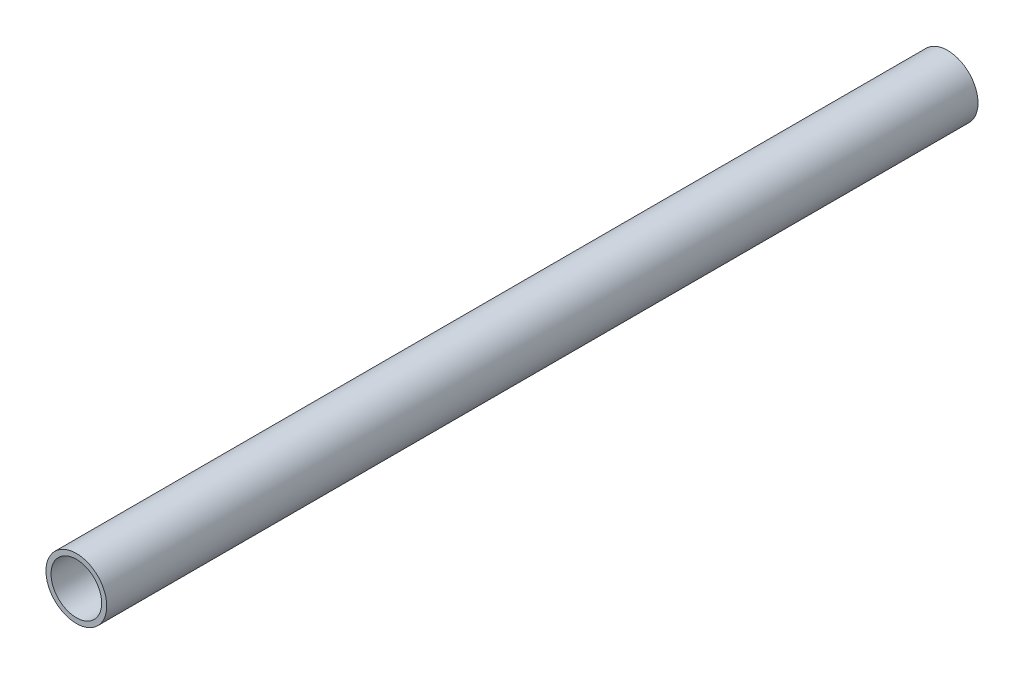
ISO-10303-21;
HEADER;
FILE_DESCRIPTION(('STEP AP214'),'2;1');
FILE_NAME('part.step','',(''),(''),'','','');
FILE_SCHEMA(('AUTOMOTIVE_DESIGN { 1 0 10303 214 1 1 1 1 }'));
ENDSEC;
DATA;
#1=APPLICATION_CONTEXT('core data for automotive mechanical design processes');
#2=APPLICATION_PROTOCOL_DEFINITION('international standard','automotive_design',2000,#1);
#3=PRODUCT_CONTEXT('',#1,'mechanical');
#4=PRODUCT('Part','Part','',(#3));
#5=PRODUCT_RELATED_PRODUCT_CATEGORY('part','',(#4));
#6=PRODUCT_DEFINITION_FORMATION('','',#4);
#7=PRODUCT_DEFINITION_CONTEXT('part definition',#1,'design');
#8=PRODUCT_DEFINITION('design','',#6,#7);
#9=PRODUCT_DEFINITION_SHAPE('','',#8);
#10=(LENGTH_UNIT() NAMED_UNIT(*) SI_UNIT(.MILLI.,.METRE.));
#11=(NAMED_UNIT(*) PLANE_ANGLE_UNIT() SI_UNIT($,.RADIAN.));
#12=(NAMED_UNIT(*) SI_UNIT($,.STERADIAN.) SOLID_ANGLE_UNIT());
#13=UNCERTAINTY_MEASURE_WITH_UNIT(LENGTH_MEASURE(1.E-05),#10,'distance_accuracy_value','');
#14=(GEOMETRIC_REPRESENTATION_CONTEXT(3) GLOBAL_UNCERTAINTY_ASSIGNED_CONTEXT((#13)) GLOBAL_UNIT_ASSIGNED_CONTEXT((#10,
#11,#12)) REPRESENTATION_CONTEXT('',''));
#15=CARTESIAN_POINT('',(0.,0.,0.));
#16=DIRECTION('',(0.,0.,1.));
#17=DIRECTION('',(1.,0.,0.));
#18=AXIS2_PLACEMENT_3D('',#15,#16,#17);
#19=CARTESIAN_POINT('',(0.,0.,172.));
#20=DIRECTION('',(0.,0.,1.));
#21=DIRECTION('',(1.,0.,0.));
#22=AXIS2_PLACEMENT_3D('',#19,#20,#21);
#23=PLANE('',#22);
#24=CARTESIAN_POINT('',(0.,0.,172.));
#25=DIRECTION('',(0.,0.,1.));
#26=DIRECTION('',(1.,0.,0.));
#27=AXIS2_PLACEMENT_3D('',#24,#25,#26);
#28=CIRCLE('',#27,6.);
#29=CARTESIAN_POINT('',(6.,0.,172.));
#30=VERTEX_POINT('',#29);
#31=EDGE_CURVE('E10',#30,#30,#28,.T.);
#32=ORIENTED_EDGE('',*,*,#31,.T.);
#33=EDGE_LOOP('',(#32));
#34=FACE_BOUND('',#33,.T.);
#35=CARTESIAN_POINT('',(0.,0.,172.));
#36=DIRECTION('',(0.,0.,1.));
#37=DIRECTION('',(1.,0.,0.));
#38=AXIS2_PLACEMENT_3D('',#35,#36,#37);
#39=CIRCLE('',#38,5.);
#40=CARTESIAN_POINT('',(5.,0.,172.));
#41=VERTEX_POINT('',#40);
#42=EDGE_CURVE('E42',#41,#41,#39,.T.);
#43=ORIENTED_EDGE('',*,*,#42,.F.);
#44=EDGE_LOOP('',(#43));
#45=FACE_BOUND('',#44,.T.);
#46=ADVANCED_FACE('F31',(#34,#45),#23,.T.);
#47=CARTESIAN_POINT('',(0.,0.,0.));
#48=DIRECTION('',(0.,0.,1.));
#49=DIRECTION('',(1.,0.,0.));
#50=AXIS2_PLACEMENT_3D('',#47,#48,#49);
#51=PLANE('',#50);
#52=CARTESIAN_POINT('',(0.,0.,0.));
#53=DIRECTION('',(0.,0.,1.));
#54=DIRECTION('',(1.,0.,0.));
#55=AXIS2_PLACEMENT_3D('',#52,#53,#54);
#56=CIRCLE('',#55,6.);
#57=CARTESIAN_POINT('',(6.,0.,0.));
#58=VERTEX_POINT('',#57);
#59=EDGE_CURVE('E35',#58,#58,#56,.T.);
#60=ORIENTED_EDGE('',*,*,#59,.F.);
#61=EDGE_LOOP('',(#60));
#62=FACE_BOUND('',#61,.T.);
#63=CARTESIAN_POINT('',(0.,0.,0.));
#64=DIRECTION('',(0.,0.,1.));
#65=DIRECTION('',(1.,0.,0.));
#66=AXIS2_PLACEMENT_3D('',#63,#64,#65);
#67=CIRCLE('',#66,5.);
#68=CARTESIAN_POINT('',(5.,0.,0.));
#69=VERTEX_POINT('',#68);
#70=EDGE_CURVE('E44',#69,#69,#67,.T.);
#71=ORIENTED_EDGE('',*,*,#70,.T.);
#72=EDGE_LOOP('',(#71));
#73=FACE_BOUND('',#72,.T.);
#74=ADVANCED_FACE('F54',(#62,#73),#51,.F.);
#75=CARTESIAN_POINT('',(0.,0.,172.));
#76=DIRECTION('',(0.,0.,-1.));
#77=DIRECTION('',(-1.,0.,0.));
#78=AXIS2_PLACEMENT_3D('',#75,#76,#77);
#79=CYLINDRICAL_SURFACE('',#78,6.);
#80=ORIENTED_EDGE('',*,*,#31,.F.);
#81=EDGE_LOOP('',(#80));
#82=FACE_BOUND('',#81,.T.);
#83=ORIENTED_EDGE('',*,*,#59,.T.);
#84=EDGE_LOOP('',(#83));
#85=FACE_BOUND('',#84,.T.);
#86=ADVANCED_FACE('F33',(#82,#85),#79,.T.);
#87=CARTESIAN_POINT('',(0.,0.,172.));
#88=DIRECTION('',(0.,0.,-1.));
#89=DIRECTION('',(-1.,0.,0.));
#90=AXIS2_PLACEMENT_3D('',#87,#88,#89);
#91=CYLINDRICAL_SURFACE('',#90,5.);
#92=ORIENTED_EDGE('',*,*,#42,.T.);
#93=EDGE_LOOP('',(#92));
#94=FACE_BOUND('',#93,.T.);
#95=ORIENTED_EDGE('',*,*,#70,.F.);
#96=EDGE_LOOP('',(#95));
#97=FACE_BOUND('',#96,.T.);
#98=ADVANCED_FACE('F50',(#94,#97),#91,.F.);
#99=CLOSED_SHELL('',(#46,#74,#86,#98));
#100=MANIFOLD_SOLID_BREP('B2',#99);
#101=ADVANCED_BREP_SHAPE_REPRESENTATION('',(#18,#100),#14);
#102=SHAPE_DEFINITION_REPRESENTATION(#9,#101);
ENDSEC;
END-ISO-10303-21;
